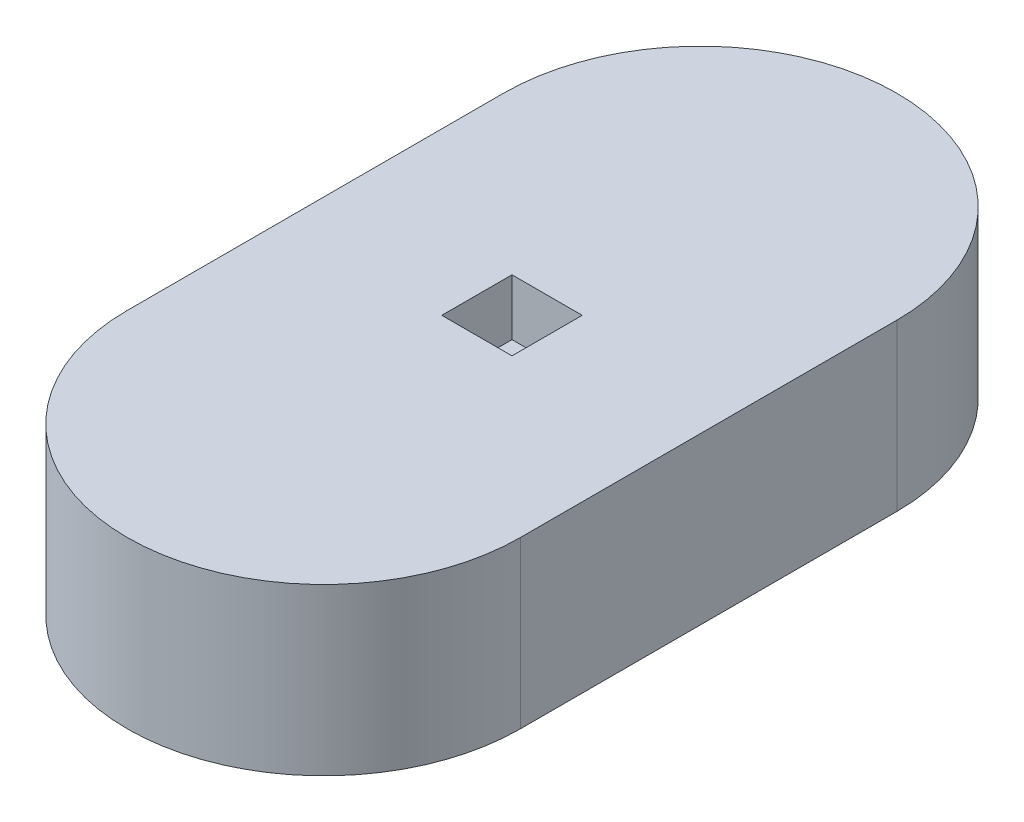
ISO-10303-21;
HEADER;
FILE_DESCRIPTION(('STEP AP214'),'2;1');
FILE_NAME('part.step','',(''),(''),'','','');
FILE_SCHEMA(('AUTOMOTIVE_DESIGN { 1 0 10303 214 1 1 1 1 }'));
ENDSEC;
DATA;
#1=APPLICATION_CONTEXT('core data for automotive mechanical design processes');
#2=APPLICATION_PROTOCOL_DEFINITION('international standard','automotive_design',2000,#1);
#3=PRODUCT_CONTEXT('',#1,'mechanical');
#4=PRODUCT('Part','Part','',(#3));
#5=PRODUCT_RELATED_PRODUCT_CATEGORY('part','',(#4));
#6=PRODUCT_DEFINITION_FORMATION('','',#4);
#7=PRODUCT_DEFINITION_CONTEXT('part definition',#1,'design');
#8=PRODUCT_DEFINITION('design','',#6,#7);
#9=PRODUCT_DEFINITION_SHAPE('','',#8);
#10=(LENGTH_UNIT() NAMED_UNIT(*) SI_UNIT(.MILLI.,.METRE.));
#11=(NAMED_UNIT(*) PLANE_ANGLE_UNIT() SI_UNIT($,.RADIAN.));
#12=(NAMED_UNIT(*) SI_UNIT($,.STERADIAN.) SOLID_ANGLE_UNIT());
#13=UNCERTAINTY_MEASURE_WITH_UNIT(LENGTH_MEASURE(1.E-05),#10,'distance_accuracy_value','');
#14=(GEOMETRIC_REPRESENTATION_CONTEXT(3) GLOBAL_UNCERTAINTY_ASSIGNED_CONTEXT((#13)) GLOBAL_UNIT_ASSIGNED_CONTEXT((#10,
#11,#12)) REPRESENTATION_CONTEXT('',''));
#15=CARTESIAN_POINT('',(0.,0.,0.));
#16=DIRECTION('',(0.,0.,1.));
#17=DIRECTION('',(1.,0.,0.));
#18=AXIS2_PLACEMENT_3D('',#15,#16,#17);
#19=CARTESIAN_POINT('',(0.,5.9,0.));
#20=DIRECTION('',(0.,-1.,0.));
#21=DIRECTION('',(0.,0.,-1.));
#22=AXIS2_PLACEMENT_3D('',#19,#20,#21);
#23=CYLINDRICAL_SURFACE('',#22,7.);
#24=CARTESIAN_POINT('',(0.,0.,0.));
#25=DIRECTION('',(0.,1.,0.));
#26=DIRECTION('',(0.,0.,1.));
#27=AXIS2_PLACEMENT_3D('',#24,#25,#26);
#28=CIRCLE('',#27,7.);
#29=CARTESIAN_POINT('',(-7.,0.,0.));
#30=VERTEX_POINT('',#29);
#31=CARTESIAN_POINT('',(7.,0.,0.));
#32=VERTEX_POINT('',#31);
#33=EDGE_CURVE('E140',#30,#32,#28,.T.);
#34=ORIENTED_EDGE('',*,*,#33,.T.);
#35=DIRECTION('',(0.,-1.,0.));
#36=VECTOR('',#35,1.);
#37=CARTESIAN_POINT('',(7.,5.9,0.));
#38=LINE('',#37,#36);
#39=CARTESIAN_POINT('',(7.,5.9,0.));
#40=VERTEX_POINT('',#39);
#41=EDGE_CURVE('E11',#40,#32,#38,.T.);
#42=ORIENTED_EDGE('',*,*,#41,.F.);
#43=CARTESIAN_POINT('',(0.,5.9,0.));
#44=DIRECTION('',(0.,1.,0.));
#45=DIRECTION('',(0.,0.,1.));
#46=AXIS2_PLACEMENT_3D('',#43,#44,#45);
#47=CIRCLE('',#46,7.);
#48=CARTESIAN_POINT('',(-7.,5.9,0.));
#49=VERTEX_POINT('',#48);
#50=EDGE_CURVE('E144',#49,#40,#47,.T.);
#51=ORIENTED_EDGE('',*,*,#50,.F.);
#52=DIRECTION('',(0.,-1.,0.));
#53=VECTOR('',#52,1.);
#54=CARTESIAN_POINT('',(-7.,5.9,0.));
#55=LINE('',#54,#53);
#56=EDGE_CURVE('E150',#49,#30,#55,.T.);
#57=ORIENTED_EDGE('',*,*,#56,.T.);
#58=EDGE_LOOP('',(#34,#42,#51,#57));
#59=FACE_BOUND('',#58,.T.);
#60=ADVANCED_FACE('F32',(#59),#23,.T.);
#61=CARTESIAN_POINT('',(7.,5.9,0.));
#62=DIRECTION('',(-1.,0.,0.));
#63=DIRECTION('',(0.,0.,1.));
#64=AXIS2_PLACEMENT_3D('',#61,#62,#63);
#65=PLANE('',#64);
#66=DIRECTION('',(0.,0.,-1.));
#67=VECTOR('',#66,1.);
#68=CARTESIAN_POINT('',(7.,0.,0.));
#69=LINE('',#68,#67);
#70=CARTESIAN_POINT('',(7.,0.,-13.4));
#71=VERTEX_POINT('',#70);
#72=EDGE_CURVE('E153',#32,#71,#69,.T.);
#73=ORIENTED_EDGE('',*,*,#72,.T.);
#74=DIRECTION('',(0.,-1.,0.));
#75=VECTOR('',#74,1.);
#76=CARTESIAN_POINT('',(7.,5.9,-13.4));
#77=LINE('',#76,#75);
#78=CARTESIAN_POINT('',(7.,5.9,-13.4));
#79=VERTEX_POINT('',#78);
#80=EDGE_CURVE('E39',#79,#71,#77,.T.);
#81=ORIENTED_EDGE('',*,*,#80,.F.);
#82=DIRECTION('',(0.,0.,-1.));
#83=VECTOR('',#82,1.);
#84=CARTESIAN_POINT('',(7.,5.9,0.));
#85=LINE('',#84,#83);
#86=EDGE_CURVE('E83',#40,#79,#85,.T.);
#87=ORIENTED_EDGE('',*,*,#86,.F.);
#88=ORIENTED_EDGE('',*,*,#41,.T.);
#89=EDGE_LOOP('',(#73,#81,#87,#88));
#90=FACE_BOUND('',#89,.T.);
#91=ADVANCED_FACE('F182',(#90),#65,.F.);
#92=CARTESIAN_POINT('',(0.,5.9,-13.4));
#93=DIRECTION('',(0.,-1.,0.));
#94=DIRECTION('',(0.,0.,-1.));
#95=AXIS2_PLACEMENT_3D('',#92,#93,#94);
#96=CYLINDRICAL_SURFACE('',#95,7.);
#97=CARTESIAN_POINT('',(0.,0.,-13.4));
#98=DIRECTION('',(0.,1.,0.));
#99=DIRECTION('',(0.,0.,1.));
#100=AXIS2_PLACEMENT_3D('',#97,#98,#99);
#101=CIRCLE('',#100,7.);
#102=CARTESIAN_POINT('',(-7.,0.,-13.4));
#103=VERTEX_POINT('',#102);
#104=EDGE_CURVE('E155',#71,#103,#101,.T.);
#105=ORIENTED_EDGE('',*,*,#104,.T.);
#106=DIRECTION('',(0.,-1.,0.));
#107=VECTOR('',#106,1.);
#108=CARTESIAN_POINT('',(-7.,5.9,-13.4));
#109=LINE('',#108,#107);
#110=CARTESIAN_POINT('',(-7.,5.9,-13.4));
#111=VERTEX_POINT('',#110);
#112=EDGE_CURVE('E159',#111,#103,#109,.T.);
#113=ORIENTED_EDGE('',*,*,#112,.F.);
#114=CARTESIAN_POINT('',(0.,5.9,-13.4));
#115=DIRECTION('',(0.,1.,0.));
#116=DIRECTION('',(0.,0.,1.));
#117=AXIS2_PLACEMENT_3D('',#114,#115,#116);
#118=CIRCLE('',#117,7.);
#119=EDGE_CURVE('E147',#79,#111,#118,.T.);
#120=ORIENTED_EDGE('',*,*,#119,.F.);
#121=ORIENTED_EDGE('',*,*,#80,.T.);
#122=EDGE_LOOP('',(#105,#113,#120,#121));
#123=FACE_BOUND('',#122,.T.);
#124=ADVANCED_FACE('F164',(#123),#96,.T.);
#125=CARTESIAN_POINT('',(-7.,5.9,0.));
#126=DIRECTION('',(1.,0.,0.));
#127=DIRECTION('',(0.,0.,-1.));
#128=AXIS2_PLACEMENT_3D('',#125,#126,#127);
#129=PLANE('',#128);
#130=DIRECTION('',(0.,0.,1.));
#131=VECTOR('',#130,1.);
#132=CARTESIAN_POINT('',(-7.,0.,0.));
#133=LINE('',#132,#131);
#134=EDGE_CURVE('E76',#103,#30,#133,.T.);
#135=ORIENTED_EDGE('',*,*,#134,.T.);
#136=ORIENTED_EDGE('',*,*,#56,.F.);
#137=DIRECTION('',(0.,0.,1.));
#138=VECTOR('',#137,1.);
#139=CARTESIAN_POINT('',(-7.,5.9,0.));
#140=LINE('',#139,#138);
#141=EDGE_CURVE('E55',#111,#49,#140,.T.);
#142=ORIENTED_EDGE('',*,*,#141,.F.);
#143=ORIENTED_EDGE('',*,*,#112,.T.);
#144=EDGE_LOOP('',(#135,#136,#142,#143));
#145=FACE_BOUND('',#144,.T.);
#146=ADVANCED_FACE('F172',(#145),#129,.F.);
#147=CARTESIAN_POINT('',(0.,5.9,0.));
#148=DIRECTION('',(0.,1.,0.));
#149=DIRECTION('',(0.,0.,1.));
#150=AXIS2_PLACEMENT_3D('',#147,#148,#149);
#151=PLANE('',#150);
#152=DIRECTION('',(0.,0.,1.));
#153=VECTOR('',#152,1.);
#154=CARTESIAN_POINT('',(-1.25,5.9,-5.45));
#155=LINE('',#154,#153);
#156=CARTESIAN_POINT('',(-1.25,5.9,-7.95));
#157=VERTEX_POINT('',#156);
#158=CARTESIAN_POINT('',(-1.25,5.9,-5.45));
#159=VERTEX_POINT('',#158);
#160=EDGE_CURVE('E46',#157,#159,#155,.T.);
#161=ORIENTED_EDGE('',*,*,#160,.F.);
#162=DIRECTION('',(-1.,0.,0.));
#163=VECTOR('',#162,1.);
#164=CARTESIAN_POINT('',(-1.25,5.9,-7.95));
#165=LINE('',#164,#163);
#166=CARTESIAN_POINT('',(1.25,5.9,-7.95));
#167=VERTEX_POINT('',#166);
#168=EDGE_CURVE('E125',#167,#157,#165,.T.);
#169=ORIENTED_EDGE('',*,*,#168,.F.);
#170=DIRECTION('',(0.,0.,-1.));
#171=VECTOR('',#170,1.);
#172=CARTESIAN_POINT('',(1.25,5.9,-5.45));
#173=LINE('',#172,#171);
#174=CARTESIAN_POINT('',(1.25,5.9,-5.45));
#175=VERTEX_POINT('',#174);
#176=EDGE_CURVE('E128',#175,#167,#173,.T.);
#177=ORIENTED_EDGE('',*,*,#176,.F.);
#178=DIRECTION('',(1.,0.,0.));
#179=VECTOR('',#178,1.);
#180=CARTESIAN_POINT('',(-1.25,5.9,-5.45));
#181=LINE('',#180,#179);
#182=EDGE_CURVE('E134',#159,#175,#181,.T.);
#183=ORIENTED_EDGE('',*,*,#182,.F.);
#184=EDGE_LOOP('',(#161,#169,#177,#183));
#185=FACE_BOUND('',#184,.T.);
#186=ORIENTED_EDGE('',*,*,#50,.T.);
#187=ORIENTED_EDGE('',*,*,#86,.T.);
#188=ORIENTED_EDGE('',*,*,#119,.T.);
#189=ORIENTED_EDGE('',*,*,#141,.T.);
#190=EDGE_LOOP('',(#186,#187,#188,#189));
#191=FACE_BOUND('',#190,.T.);
#192=ADVANCED_FACE('F174',(#185,#191),#151,.T.);
#193=CARTESIAN_POINT('',(0.,0.,0.));
#194=DIRECTION('',(0.,1.,0.));
#195=DIRECTION('',(0.,0.,1.));
#196=AXIS2_PLACEMENT_3D('',#193,#194,#195);
#197=PLANE('',#196);
#198=ORIENTED_EDGE('',*,*,#33,.F.);
#199=ORIENTED_EDGE('',*,*,#134,.F.);
#200=ORIENTED_EDGE('',*,*,#104,.F.);
#201=ORIENTED_EDGE('',*,*,#72,.F.);
#202=EDGE_LOOP('',(#198,#199,#200,#201));
#203=FACE_BOUND('',#202,.T.);
#204=ADVANCED_FACE('F168',(#203),#197,.F.);
#205=CARTESIAN_POINT('',(-1.25,3.9,-5.45));
#206=DIRECTION('',(-1.,0.,0.));
#207=DIRECTION('',(0.,0.,1.));
#208=AXIS2_PLACEMENT_3D('',#205,#206,#207);
#209=PLANE('',#208);
#210=ORIENTED_EDGE('',*,*,#160,.T.);
#211=DIRECTION('',(0.,1.,0.));
#212=VECTOR('',#211,1.);
#213=CARTESIAN_POINT('',(-1.25,3.9,-5.45));
#214=LINE('',#213,#212);
#215=CARTESIAN_POINT('',(-1.25,3.9,-5.45));
#216=VERTEX_POINT('',#215);
#217=EDGE_CURVE('E103',#216,#159,#214,.T.);
#218=ORIENTED_EDGE('',*,*,#217,.F.);
#219=DIRECTION('',(0.,0.,1.));
#220=VECTOR('',#219,1.);
#221=CARTESIAN_POINT('',(-1.25,3.9,-5.45));
#222=LINE('',#221,#220);
#223=CARTESIAN_POINT('',(-1.25,3.9,-7.95));
#224=VERTEX_POINT('',#223);
#225=EDGE_CURVE('E107',#224,#216,#222,.T.);
#226=ORIENTED_EDGE('',*,*,#225,.F.);
#227=DIRECTION('',(0.,1.,0.));
#228=VECTOR('',#227,1.);
#229=CARTESIAN_POINT('',(-1.25,3.9,-7.95));
#230=LINE('',#229,#228);
#231=EDGE_CURVE('E138',#224,#157,#230,.T.);
#232=ORIENTED_EDGE('',*,*,#231,.T.);
#233=EDGE_LOOP('',(#210,#218,#226,#232));
#234=FACE_BOUND('',#233,.T.);
#235=ADVANCED_FACE('F105',(#234),#209,.F.);
#236=CARTESIAN_POINT('',(-1.25,3.9,-7.95));
#237=DIRECTION('',(0.,0.,-1.));
#238=DIRECTION('',(-1.,0.,0.));
#239=AXIS2_PLACEMENT_3D('',#236,#237,#238);
#240=PLANE('',#239);
#241=ORIENTED_EDGE('',*,*,#168,.T.);
#242=ORIENTED_EDGE('',*,*,#231,.F.);
#243=DIRECTION('',(-1.,0.,0.));
#244=VECTOR('',#243,1.);
#245=CARTESIAN_POINT('',(-1.25,3.9,-7.95));
#246=LINE('',#245,#244);
#247=CARTESIAN_POINT('',(1.25,3.9,-7.95));
#248=VERTEX_POINT('',#247);
#249=EDGE_CURVE('E113',#248,#224,#246,.T.);
#250=ORIENTED_EDGE('',*,*,#249,.F.);
#251=DIRECTION('',(0.,1.,0.));
#252=VECTOR('',#251,1.);
#253=CARTESIAN_POINT('',(1.25,3.9,-7.95));
#254=LINE('',#253,#252);
#255=EDGE_CURVE('E141',#248,#167,#254,.T.);
#256=ORIENTED_EDGE('',*,*,#255,.T.);
#257=EDGE_LOOP('',(#241,#242,#250,#256));
#258=FACE_BOUND('',#257,.T.);
#259=ADVANCED_FACE('F221',(#258),#240,.F.);
#260=CARTESIAN_POINT('',(1.25,3.9,-5.45));
#261=DIRECTION('',(1.,0.,0.));
#262=DIRECTION('',(0.,0.,-1.));
#263=AXIS2_PLACEMENT_3D('',#260,#261,#262);
#264=PLANE('',#263);
#265=ORIENTED_EDGE('',*,*,#176,.T.);
#266=ORIENTED_EDGE('',*,*,#255,.F.);
#267=DIRECTION('',(0.,0.,-1.));
#268=VECTOR('',#267,1.);
#269=CARTESIAN_POINT('',(1.25,3.9,-5.45));
#270=LINE('',#269,#268);
#271=CARTESIAN_POINT('',(1.25,3.9,-5.45));
#272=VERTEX_POINT('',#271);
#273=EDGE_CURVE('E121',#272,#248,#270,.T.);
#274=ORIENTED_EDGE('',*,*,#273,.F.);
#275=DIRECTION('',(0.,1.,0.));
#276=VECTOR('',#275,1.);
#277=CARTESIAN_POINT('',(1.25,3.9,-5.45));
#278=LINE('',#277,#276);
#279=EDGE_CURVE('E112',#272,#175,#278,.T.);
#280=ORIENTED_EDGE('',*,*,#279,.T.);
#281=EDGE_LOOP('',(#265,#266,#274,#280));
#282=FACE_BOUND('',#281,.T.);
#283=ADVANCED_FACE('F230',(#282),#264,.F.);
#284=CARTESIAN_POINT('',(-1.25,3.9,-5.45));
#285=DIRECTION('',(0.,0.,1.));
#286=DIRECTION('',(1.,0.,0.));
#287=AXIS2_PLACEMENT_3D('',#284,#285,#286);
#288=PLANE('',#287);
#289=ORIENTED_EDGE('',*,*,#182,.T.);
#290=ORIENTED_EDGE('',*,*,#279,.F.);
#291=DIRECTION('',(1.,0.,0.));
#292=VECTOR('',#291,1.);
#293=CARTESIAN_POINT('',(-1.25,3.9,-5.45));
#294=LINE('',#293,#292);
#295=EDGE_CURVE('E116',#216,#272,#294,.T.);
#296=ORIENTED_EDGE('',*,*,#295,.F.);
#297=ORIENTED_EDGE('',*,*,#217,.T.);
#298=EDGE_LOOP('',(#289,#290,#296,#297));
#299=FACE_BOUND('',#298,.T.);
#300=ADVANCED_FACE('F117',(#299),#288,.F.);
#301=CARTESIAN_POINT('',(0.,3.9,0.));
#302=DIRECTION('',(0.,-1.,0.));
#303=DIRECTION('',(0.,0.,-1.));
#304=AXIS2_PLACEMENT_3D('',#301,#302,#303);
#305=PLANE('',#304);
#306=ORIENTED_EDGE('',*,*,#225,.T.);
#307=ORIENTED_EDGE('',*,*,#295,.T.);
#308=ORIENTED_EDGE('',*,*,#273,.T.);
#309=ORIENTED_EDGE('',*,*,#249,.T.);
#310=EDGE_LOOP('',(#306,#307,#308,#309));
#311=FACE_BOUND('',#310,.T.);
#312=ADVANCED_FACE('F123',(#311),#305,.F.);
#313=CLOSED_SHELL('',(#60,#91,#124,#146,#192,#204,#235,#259,#283,#300,#312));
#314=MANIFOLD_SOLID_BREP('B2',#313);
#315=ADVANCED_BREP_SHAPE_REPRESENTATION('',(#18,#314),#14);
#316=SHAPE_DEFINITION_REPRESENTATION(#9,#315);
ENDSEC;
END-ISO-10303-21;
